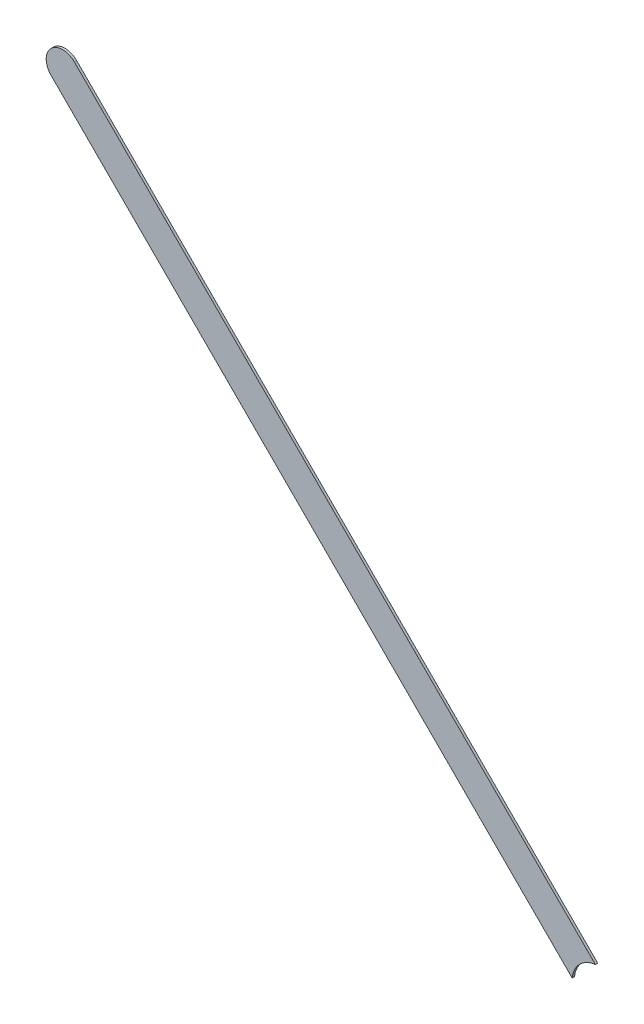
ISO-10303-21;
HEADER;
FILE_DESCRIPTION(('STEP AP214'),'2;1');
FILE_NAME('part.step','',(''),(''),'','','');
FILE_SCHEMA(('AUTOMOTIVE_DESIGN { 1 0 10303 214 1 1 1 1 }'));
ENDSEC;
DATA;
#1=APPLICATION_CONTEXT('core data for automotive mechanical design processes');
#2=APPLICATION_PROTOCOL_DEFINITION('international standard','automotive_design',2000,#1);
#3=PRODUCT_CONTEXT('',#1,'mechanical');
#4=PRODUCT('Part','Part','',(#3));
#5=PRODUCT_RELATED_PRODUCT_CATEGORY('part','',(#4));
#6=PRODUCT_DEFINITION_FORMATION('','',#4);
#7=PRODUCT_DEFINITION_CONTEXT('part definition',#1,'design');
#8=PRODUCT_DEFINITION('design','',#6,#7);
#9=PRODUCT_DEFINITION_SHAPE('','',#8);
#10=(LENGTH_UNIT() NAMED_UNIT(*) SI_UNIT(.MILLI.,.METRE.));
#11=(NAMED_UNIT(*) PLANE_ANGLE_UNIT() SI_UNIT($,.RADIAN.));
#12=(NAMED_UNIT(*) SI_UNIT($,.STERADIAN.) SOLID_ANGLE_UNIT());
#13=UNCERTAINTY_MEASURE_WITH_UNIT(LENGTH_MEASURE(1.E-05),#10,'distance_accuracy_value','');
#14=(GEOMETRIC_REPRESENTATION_CONTEXT(3) GLOBAL_UNCERTAINTY_ASSIGNED_CONTEXT((#13)) GLOBAL_UNIT_ASSIGNED_CONTEXT((#10,
#11,#12)) REPRESENTATION_CONTEXT('',''));
#15=CARTESIAN_POINT('',(0.,0.,0.));
#16=DIRECTION('',(0.,0.,1.));
#17=DIRECTION('',(1.,0.,0.));
#18=AXIS2_PLACEMENT_3D('',#15,#16,#17);
#19=CARTESIAN_POINT('',(56.72322412,83.26325232,0.));
#20=DIRECTION('',(0.707106781186547,0.707106781186548,0.));
#21=DIRECTION('',(0.707106781186548,-0.707106781186547,0.));
#22=AXIS2_PLACEMENT_3D('',#19,#20,#21);
#23=PLANE('',#22);
#24=DIRECTION('',(0.707106781186548,-0.707106781186547,0.));
#25=VECTOR('',#24,1.);
#26=CARTESIAN_POINT('',(56.72322412,83.26325232,0.03556));
#27=LINE('',#26,#25);
#28=CARTESIAN_POINT('',(56.72322412,83.26325232,0.03556));
#29=VERTEX_POINT('',#28);
#30=CARTESIAN_POINT('',(64.6424320705598,75.3440443694402,0.03556));
#31=VERTEX_POINT('',#30);
#32=EDGE_CURVE('E11',#29,#31,#27,.T.);
#33=ORIENTED_EDGE('',*,*,#32,.F.);
#34=DIRECTION('',(0.,0.,1.));
#35=VECTOR('',#34,1.);
#36=CARTESIAN_POINT('',(56.72322412,83.26325232,0.));
#37=LINE('',#36,#35);
#38=CARTESIAN_POINT('',(56.72322412,83.26325232,0.));
#39=VERTEX_POINT('',#38);
#40=EDGE_CURVE('E24',#39,#29,#37,.T.);
#41=ORIENTED_EDGE('',*,*,#40,.F.);
#42=DIRECTION('',(0.707106781186548,-0.707106781186547,0.));
#43=VECTOR('',#42,1.);
#44=CARTESIAN_POINT('',(56.72322412,83.26325232,0.));
#45=LINE('',#44,#43);
#46=CARTESIAN_POINT('',(64.6424320705598,75.3440443694402,0.));
#47=VERTEX_POINT('',#46);
#48=EDGE_CURVE('E75',#39,#47,#45,.T.);
#49=ORIENTED_EDGE('',*,*,#48,.T.);
#50=DIRECTION('',(0.,0.,1.));
#51=VECTOR('',#50,1.);
#52=CARTESIAN_POINT('',(64.6424320705598,75.3440443694402,0.));
#53=LINE('',#52,#51);
#54=EDGE_CURVE('E37',#47,#31,#53,.T.);
#55=ORIENTED_EDGE('',*,*,#54,.T.);
#56=EDGE_LOOP('',(#33,#41,#49,#55));
#57=FACE_BOUND('',#56,.T.);
#58=ADVANCED_FACE('F17',(#57),#23,.F.);
#59=CARTESIAN_POINT('',(65.040002,75.3000272,0.));
#60=DIRECTION('',(0.,0.,-1.));
#61=DIRECTION('',(1.,0.,0.));
#62=AXIS2_PLACEMENT_3D('',#59,#60,#61);
#63=CYLINDRICAL_SURFACE('',#62,0.3999992);
#64=DIRECTION('',(0.,0.,1.));
#65=VECTOR('',#64,1.);
#66=CARTESIAN_POINT('',(64.9959848305598,75.6975971294402,0.));
#67=LINE('',#66,#65);
#68=CARTESIAN_POINT('',(64.9959848305598,75.6975971294402,0.));
#69=VERTEX_POINT('',#68);
#70=CARTESIAN_POINT('',(64.9959848305598,75.6975971294402,0.03556));
#71=VERTEX_POINT('',#70);
#72=EDGE_CURVE('E67',#69,#71,#67,.T.);
#73=ORIENTED_EDGE('',*,*,#72,.T.);
#74=CARTESIAN_POINT('',(65.040002,75.3000272,0.03556));
#75=DIRECTION('',(0.,0.,1.));
#76=DIRECTION('',(1.,0.,0.));
#77=AXIS2_PLACEMENT_3D('',#74,#75,#76);
#78=CIRCLE('',#77,0.3999992);
#79=EDGE_CURVE('E82',#71,#31,#78,.T.);
#80=ORIENTED_EDGE('',*,*,#79,.T.);
#81=ORIENTED_EDGE('',*,*,#54,.F.);
#82=CARTESIAN_POINT('',(65.040002,75.3000272,0.));
#83=DIRECTION('',(0.,0.,1.));
#84=DIRECTION('',(1.,0.,0.));
#85=AXIS2_PLACEMENT_3D('',#82,#83,#84);
#86=CIRCLE('',#85,0.3999992);
#87=EDGE_CURVE('E80',#69,#47,#86,.T.);
#88=ORIENTED_EDGE('',*,*,#87,.F.);
#89=EDGE_LOOP('',(#73,#80,#81,#88));
#90=FACE_BOUND('',#89,.T.);
#91=ADVANCED_FACE('F88',(#90),#63,.F.);
#92=CARTESIAN_POINT('',(64.9959848305598,75.6975971294402,0.));
#93=DIRECTION('',(-0.707106781186548,-0.707106781186548,0.));
#94=DIRECTION('',(-0.707106781186548,0.707106781186548,0.));
#95=AXIS2_PLACEMENT_3D('',#92,#93,#94);
#96=PLANE('',#95);
#97=DIRECTION('',(-0.707106781186548,0.707106781186548,0.));
#98=VECTOR('',#97,1.);
#99=CARTESIAN_POINT('',(65.21677838,75.47680358,0.03556));
#100=LINE('',#99,#98);
#101=CARTESIAN_POINT('',(57.07677688,83.61680508,0.03556));
#102=VERTEX_POINT('',#101);
#103=EDGE_CURVE('E71',#71,#102,#100,.T.);
#104=ORIENTED_EDGE('',*,*,#103,.F.);
#105=ORIENTED_EDGE('',*,*,#72,.F.);
#106=DIRECTION('',(-0.707106781186548,0.707106781186548,0.));
#107=VECTOR('',#106,1.);
#108=CARTESIAN_POINT('',(65.21677838,75.47680358,0.));
#109=LINE('',#108,#107);
#110=CARTESIAN_POINT('',(57.07677688,83.61680508,0.));
#111=VERTEX_POINT('',#110);
#112=EDGE_CURVE('E63',#69,#111,#109,.T.);
#113=ORIENTED_EDGE('',*,*,#112,.T.);
#114=DIRECTION('',(0.,0.,1.));
#115=VECTOR('',#114,1.);
#116=CARTESIAN_POINT('',(57.07677688,83.61680508,0.));
#117=LINE('',#116,#115);
#118=EDGE_CURVE('E53',#111,#102,#117,.T.);
#119=ORIENTED_EDGE('',*,*,#118,.T.);
#120=EDGE_LOOP('',(#104,#105,#113,#119));
#121=FACE_BOUND('',#120,.T.);
#122=ADVANCED_FACE('F66',(#121),#96,.F.);
#123=CARTESIAN_POINT('',(56.9000005,83.4400287,0.));
#124=DIRECTION('',(0.,0.,-1.));
#125=DIRECTION('',(0.707106781186576,0.707106781186519,0.));
#126=AXIS2_PLACEMENT_3D('',#123,#124,#125);
#127=CYLINDRICAL_SURFACE('',#126,0.24999955410322);
#128=CARTESIAN_POINT('',(56.9000005,83.4400287,0.03556));
#129=DIRECTION('',(0.,0.,1.));
#130=DIRECTION('',(0.707106781186576,0.707106781186519,0.));
#131=AXIS2_PLACEMENT_3D('',#128,#129,#130);
#132=CIRCLE('',#131,0.24999955410322);
#133=EDGE_CURVE('E59',#102,#29,#132,.T.);
#134=ORIENTED_EDGE('',*,*,#133,.F.);
#135=ORIENTED_EDGE('',*,*,#118,.F.);
#136=CARTESIAN_POINT('',(56.9000005,83.4400287,0.));
#137=DIRECTION('',(0.,0.,1.));
#138=DIRECTION('',(0.707106781186576,0.707106781186519,0.));
#139=AXIS2_PLACEMENT_3D('',#136,#137,#138);
#140=CIRCLE('',#139,0.24999955410322);
#141=EDGE_CURVE('E57',#111,#39,#140,.T.);
#142=ORIENTED_EDGE('',*,*,#141,.T.);
#143=ORIENTED_EDGE('',*,*,#40,.T.);
#144=EDGE_LOOP('',(#134,#135,#142,#143));
#145=FACE_BOUND('',#144,.T.);
#146=ADVANCED_FACE('F55',(#145),#127,.T.);
#147=CARTESIAN_POINT('',(56.72322412,83.26325232,0.));
#148=DIRECTION('',(0.,0.,-1.));
#149=DIRECTION('',(-1.,0.,0.));
#150=AXIS2_PLACEMENT_3D('',#147,#148,#149);
#151=PLANE('',#150);
#152=ORIENTED_EDGE('',*,*,#48,.F.);
#153=ORIENTED_EDGE('',*,*,#141,.F.);
#154=ORIENTED_EDGE('',*,*,#112,.F.);
#155=ORIENTED_EDGE('',*,*,#87,.T.);
#156=EDGE_LOOP('',(#152,#153,#154,#155));
#157=FACE_BOUND('',#156,.T.);
#158=ADVANCED_FACE('F74',(#157),#151,.T.);
#159=CARTESIAN_POINT('',(56.72322412,83.26325232,0.03556));
#160=DIRECTION('',(0.,0.,-1.));
#161=DIRECTION('',(-1.,0.,0.));
#162=AXIS2_PLACEMENT_3D('',#159,#160,#161);
#163=PLANE('',#162);
#164=ORIENTED_EDGE('',*,*,#133,.T.);
#165=ORIENTED_EDGE('',*,*,#32,.T.);
#166=ORIENTED_EDGE('',*,*,#79,.F.);
#167=ORIENTED_EDGE('',*,*,#103,.T.);
#168=EDGE_LOOP('',(#164,#165,#166,#167));
#169=FACE_BOUND('',#168,.T.);
#170=ADVANCED_FACE('F91',(#169),#163,.F.);
#171=CLOSED_SHELL('',(#58,#91,#122,#146,#158,#170));
#172=MANIFOLD_SOLID_BREP('B1',#171);
#173=ADVANCED_BREP_SHAPE_REPRESENTATION('',(#18,#172),#14);
#174=SHAPE_DEFINITION_REPRESENTATION(#9,#173);
ENDSEC;
END-ISO-10303-21;
